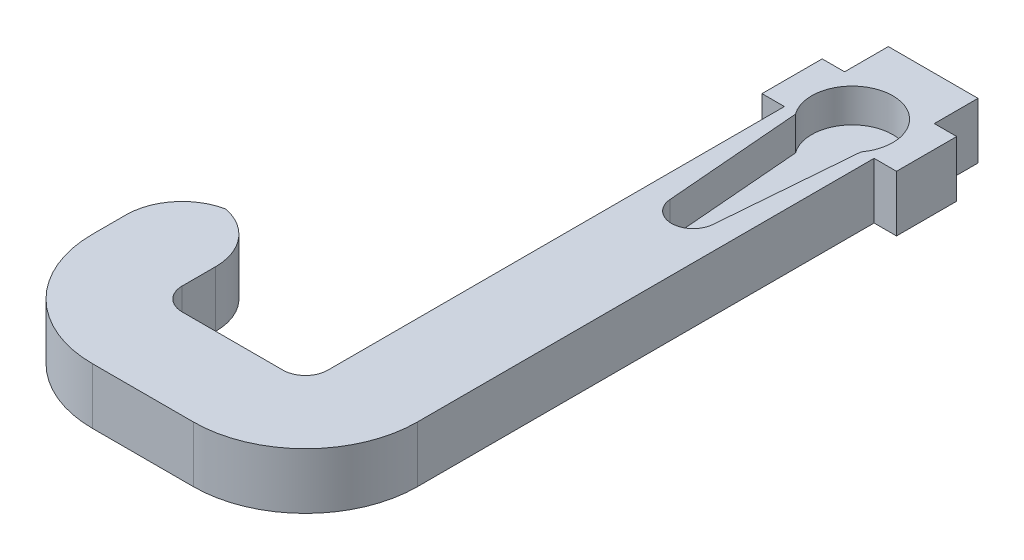
ISO-10303-21;
HEADER;
FILE_DESCRIPTION(('STEP AP214'),'2;1');
FILE_NAME('part.step','',(''),(''),'','','');
FILE_SCHEMA(('AUTOMOTIVE_DESIGN { 1 0 10303 214 1 1 1 1 }'));
ENDSEC;
DATA;
#1=APPLICATION_CONTEXT('core data for automotive mechanical design processes');
#2=APPLICATION_PROTOCOL_DEFINITION('international standard','automotive_design',2000,#1);
#3=PRODUCT_CONTEXT('',#1,'mechanical');
#4=PRODUCT('Part','Part','',(#3));
#5=PRODUCT_RELATED_PRODUCT_CATEGORY('part','',(#4));
#6=PRODUCT_DEFINITION_FORMATION('','',#4);
#7=PRODUCT_DEFINITION_CONTEXT('part definition',#1,'design');
#8=PRODUCT_DEFINITION('design','',#6,#7);
#9=PRODUCT_DEFINITION_SHAPE('','',#8);
#10=(LENGTH_UNIT() NAMED_UNIT(*) SI_UNIT(.MILLI.,.METRE.));
#11=(NAMED_UNIT(*) PLANE_ANGLE_UNIT() SI_UNIT($,.RADIAN.));
#12=(NAMED_UNIT(*) SI_UNIT($,.STERADIAN.) SOLID_ANGLE_UNIT());
#13=UNCERTAINTY_MEASURE_WITH_UNIT(LENGTH_MEASURE(1.E-05),#10,'distance_accuracy_value','');
#14=(GEOMETRIC_REPRESENTATION_CONTEXT(3) GLOBAL_UNCERTAINTY_ASSIGNED_CONTEXT((#13)) GLOBAL_UNIT_ASSIGNED_CONTEXT((#10,
#11,#12)) REPRESENTATION_CONTEXT('',''));
#15=CARTESIAN_POINT('',(0.,0.,0.));
#16=DIRECTION('',(0.,0.,1.));
#17=DIRECTION('',(1.,0.,0.));
#18=AXIS2_PLACEMENT_3D('',#15,#16,#17);
#19=CARTESIAN_POINT('',(21.,5.,-52.1));
#20=DIRECTION('',(-1.,0.,0.));
#21=DIRECTION('',(0.,0.,1.));
#22=AXIS2_PLACEMENT_3D('',#19,#20,#21);
#23=PLANE('',#22);
#24=DIRECTION('',(0.,0.,-1.));
#25=VECTOR('',#24,1.);
#26=CARTESIAN_POINT('',(21.,0.,-52.1));
#27=LINE('',#26,#25);
#28=CARTESIAN_POINT('',(21.,0.,-52.1));
#29=VERTEX_POINT('',#28);
#30=CARTESIAN_POINT('',(21.,0.,-56.));
#31=VERTEX_POINT('',#30);
#32=EDGE_CURVE('E261',#29,#31,#27,.T.);
#33=ORIENTED_EDGE('',*,*,#32,.T.);
#34=DIRECTION('',(0.,-1.,0.));
#35=VECTOR('',#34,1.);
#36=CARTESIAN_POINT('',(21.,5.,-56.));
#37=LINE('',#36,#35);
#38=CARTESIAN_POINT('',(21.,5.,-56.));
#39=VERTEX_POINT('',#38);
#40=EDGE_CURVE('E398',#39,#31,#37,.T.);
#41=ORIENTED_EDGE('',*,*,#40,.F.);
#42=DIRECTION('',(0.,0.,-1.));
#43=VECTOR('',#42,1.);
#44=CARTESIAN_POINT('',(21.,5.,-52.1));
#45=LINE('',#44,#43);
#46=CARTESIAN_POINT('',(21.,5.,-52.1));
#47=VERTEX_POINT('',#46);
#48=EDGE_CURVE('E267',#47,#39,#45,.T.);
#49=ORIENTED_EDGE('',*,*,#48,.F.);
#50=DIRECTION('',(0.,-1.,0.));
#51=VECTOR('',#50,1.);
#52=CARTESIAN_POINT('',(21.,5.,-52.1));
#53=LINE('',#52,#51);
#54=EDGE_CURVE('E316',#47,#29,#53,.T.);
#55=ORIENTED_EDGE('',*,*,#54,.T.);
#56=EDGE_LOOP('',(#33,#41,#49,#55));
#57=FACE_BOUND('',#56,.T.);
#58=ADVANCED_FACE('F43',(#57),#23,.F.);
#59=CARTESIAN_POINT('',(13.,5.,-56.));
#60=DIRECTION('',(0.,0.,1.));
#61=DIRECTION('',(1.,0.,0.));
#62=AXIS2_PLACEMENT_3D('',#59,#60,#61);
#63=PLANE('',#62);
#64=DIRECTION('',(-1.,0.,0.));
#65=VECTOR('',#64,1.);
#66=CARTESIAN_POINT('',(13.,0.,-56.));
#67=LINE('',#66,#65);
#68=CARTESIAN_POINT('',(13.,0.,-56.));
#69=VERTEX_POINT('',#68);
#70=EDGE_CURVE('E320',#31,#69,#67,.T.);
#71=ORIENTED_EDGE('',*,*,#70,.T.);
#72=DIRECTION('',(0.,-1.,0.));
#73=VECTOR('',#72,1.);
#74=CARTESIAN_POINT('',(13.,5.,-56.));
#75=LINE('',#74,#73);
#76=CARTESIAN_POINT('',(13.,5.,-56.));
#77=VERTEX_POINT('',#76);
#78=EDGE_CURVE('E394',#77,#69,#75,.T.);
#79=ORIENTED_EDGE('',*,*,#78,.F.);
#80=DIRECTION('',(-1.,0.,0.));
#81=VECTOR('',#80,1.);
#82=CARTESIAN_POINT('',(13.,5.,-56.));
#83=LINE('',#82,#81);
#84=EDGE_CURVE('E271',#39,#77,#83,.T.);
#85=ORIENTED_EDGE('',*,*,#84,.F.);
#86=ORIENTED_EDGE('',*,*,#40,.T.);
#87=EDGE_LOOP('',(#71,#79,#85,#86));
#88=FACE_BOUND('',#87,.T.);
#89=ADVANCED_FACE('F516',(#88),#63,.F.);
#90=CARTESIAN_POINT('',(13.,5.,-52.1));
#91=DIRECTION('',(1.,0.,0.));
#92=DIRECTION('',(0.,0.,-1.));
#93=AXIS2_PLACEMENT_3D('',#90,#91,#92);
#94=PLANE('',#93);
#95=DIRECTION('',(0.,0.,1.));
#96=VECTOR('',#95,1.);
#97=CARTESIAN_POINT('',(13.,0.,-52.1));
#98=LINE('',#97,#96);
#99=CARTESIAN_POINT('',(13.,0.,-52.1));
#100=VERTEX_POINT('',#99);
#101=EDGE_CURVE('E323',#69,#100,#98,.T.);
#102=ORIENTED_EDGE('',*,*,#101,.T.);
#103=DIRECTION('',(0.,-1.,0.));
#104=VECTOR('',#103,1.);
#105=CARTESIAN_POINT('',(13.,5.,-52.1));
#106=LINE('',#105,#104);
#107=CARTESIAN_POINT('',(13.,5.,-52.1));
#108=VERTEX_POINT('',#107);
#109=EDGE_CURVE('E390',#108,#100,#106,.T.);
#110=ORIENTED_EDGE('',*,*,#109,.F.);
#111=DIRECTION('',(0.,0.,1.));
#112=VECTOR('',#111,1.);
#113=CARTESIAN_POINT('',(13.,5.,-52.1));
#114=LINE('',#113,#112);
#115=EDGE_CURVE('E275',#77,#108,#114,.T.);
#116=ORIENTED_EDGE('',*,*,#115,.F.);
#117=ORIENTED_EDGE('',*,*,#78,.T.);
#118=EDGE_LOOP('',(#102,#110,#116,#117));
#119=FACE_BOUND('',#118,.T.);
#120=ADVANCED_FACE('F512',(#119),#94,.F.);
#121=CARTESIAN_POINT('',(11.,5.,-52.1));
#122=DIRECTION('',(0.,0.,1.));
#123=DIRECTION('',(1.,0.,0.));
#124=AXIS2_PLACEMENT_3D('',#121,#122,#123);
#125=PLANE('',#124);
#126=DIRECTION('',(-1.,0.,0.));
#127=VECTOR('',#126,1.);
#128=CARTESIAN_POINT('',(11.,0.,-52.1));
#129=LINE('',#128,#127);
#130=CARTESIAN_POINT('',(11.,0.,-52.1));
#131=VERTEX_POINT('',#130);
#132=EDGE_CURVE('E326',#100,#131,#129,.T.);
#133=ORIENTED_EDGE('',*,*,#132,.T.);
#134=DIRECTION('',(0.,-1.,0.));
#135=VECTOR('',#134,1.);
#136=CARTESIAN_POINT('',(11.,5.,-52.1));
#137=LINE('',#136,#135);
#138=CARTESIAN_POINT('',(11.,5.,-52.1));
#139=VERTEX_POINT('',#138);
#140=EDGE_CURVE('E386',#139,#131,#137,.T.);
#141=ORIENTED_EDGE('',*,*,#140,.F.);
#142=DIRECTION('',(-1.,0.,0.));
#143=VECTOR('',#142,1.);
#144=CARTESIAN_POINT('',(11.,5.,-52.1));
#145=LINE('',#144,#143);
#146=EDGE_CURVE('E278',#108,#139,#145,.T.);
#147=ORIENTED_EDGE('',*,*,#146,.F.);
#148=ORIENTED_EDGE('',*,*,#109,.T.);
#149=EDGE_LOOP('',(#133,#141,#147,#148));
#150=FACE_BOUND('',#149,.T.);
#151=ADVANCED_FACE('F507',(#150),#125,.F.);
#152=CARTESIAN_POINT('',(11.,5.,-52.1));
#153=DIRECTION('',(1.,0.,0.));
#154=DIRECTION('',(0.,0.,-1.));
#155=AXIS2_PLACEMENT_3D('',#152,#153,#154);
#156=PLANE('',#155);
#157=DIRECTION('',(0.,0.,1.));
#158=VECTOR('',#157,1.);
#159=CARTESIAN_POINT('',(11.,0.,-52.1));
#160=LINE('',#159,#158);
#161=CARTESIAN_POINT('',(11.,0.,-46.73));
#162=VERTEX_POINT('',#161);
#163=EDGE_CURVE('E329',#131,#162,#160,.T.);
#164=ORIENTED_EDGE('',*,*,#163,.T.);
#165=DIRECTION('',(0.,-1.,0.));
#166=VECTOR('',#165,1.);
#167=CARTESIAN_POINT('',(11.,5.,-46.73));
#168=LINE('',#167,#166);
#169=CARTESIAN_POINT('',(11.,5.,-46.73));
#170=VERTEX_POINT('',#169);
#171=EDGE_CURVE('E382',#170,#162,#168,.T.);
#172=ORIENTED_EDGE('',*,*,#171,.F.);
#173=DIRECTION('',(0.,0.,1.));
#174=VECTOR('',#173,1.);
#175=CARTESIAN_POINT('',(11.,5.,-52.1));
#176=LINE('',#175,#174);
#177=EDGE_CURVE('E281',#139,#170,#176,.T.);
#178=ORIENTED_EDGE('',*,*,#177,.F.);
#179=ORIENTED_EDGE('',*,*,#140,.T.);
#180=EDGE_LOOP('',(#164,#172,#178,#179));
#181=FACE_BOUND('',#180,.T.);
#182=ADVANCED_FACE('F503',(#181),#156,.F.);
#183=CARTESIAN_POINT('',(11.,5.,-46.73));
#184=DIRECTION('',(0.,0.,-1.));
#185=DIRECTION('',(-1.,0.,0.));
#186=AXIS2_PLACEMENT_3D('',#183,#184,#185);
#187=PLANE('',#186);
#188=DIRECTION('',(1.,0.,0.));
#189=VECTOR('',#188,1.);
#190=CARTESIAN_POINT('',(11.,0.,-46.73));
#191=LINE('',#190,#189);
#192=CARTESIAN_POINT('',(13.,0.,-46.73));
#193=VERTEX_POINT('',#192);
#194=EDGE_CURVE('E332',#162,#193,#191,.T.);
#195=ORIENTED_EDGE('',*,*,#194,.T.);
#196=DIRECTION('',(0.,-1.,0.));
#197=VECTOR('',#196,1.);
#198=CARTESIAN_POINT('',(13.,5.,-46.73));
#199=LINE('',#198,#197);
#200=CARTESIAN_POINT('',(13.,5.,-46.73));
#201=VERTEX_POINT('',#200);
#202=EDGE_CURVE('E378',#201,#193,#199,.T.);
#203=ORIENTED_EDGE('',*,*,#202,.F.);
#204=DIRECTION('',(1.,0.,0.));
#205=VECTOR('',#204,1.);
#206=CARTESIAN_POINT('',(11.,5.,-46.73));
#207=LINE('',#206,#205);
#208=EDGE_CURVE('E284',#170,#201,#207,.T.);
#209=ORIENTED_EDGE('',*,*,#208,.F.);
#210=ORIENTED_EDGE('',*,*,#171,.T.);
#211=EDGE_LOOP('',(#195,#203,#209,#210));
#212=FACE_BOUND('',#211,.T.);
#213=ADVANCED_FACE('F499',(#212),#187,.F.);
#214=CARTESIAN_POINT('',(13.,5.,-4.));
#215=DIRECTION('',(1.,0.,0.));
#216=DIRECTION('',(0.,0.,-1.));
#217=AXIS2_PLACEMENT_3D('',#214,#215,#216);
#218=PLANE('',#217);
#219=DIRECTION('',(0.,0.,1.));
#220=VECTOR('',#219,1.);
#221=CARTESIAN_POINT('',(13.,0.,-4.));
#222=LINE('',#221,#220);
#223=CARTESIAN_POINT('',(13.,0.,-6.00000000000001));
#224=VERTEX_POINT('',#223);
#225=EDGE_CURVE('E335',#193,#224,#222,.T.);
#226=ORIENTED_EDGE('',*,*,#225,.T.);
#227=DIRECTION('',(0.,-1.,0.));
#228=VECTOR('',#227,1.);
#229=CARTESIAN_POINT('',(13.,5.,-6.00000000000001));
#230=LINE('',#229,#228);
#231=CARTESIAN_POINT('',(13.,5.,-6.00000000000001));
#232=VERTEX_POINT('',#231);
#233=EDGE_CURVE('E59',#224,#232,#230,.F.);
#234=ORIENTED_EDGE('',*,*,#233,.T.);
#235=DIRECTION('',(0.,0.,1.));
#236=VECTOR('',#235,1.);
#237=CARTESIAN_POINT('',(13.,5.,-4.));
#238=LINE('',#237,#236);
#239=EDGE_CURVE('E287',#201,#232,#238,.T.);
#240=ORIENTED_EDGE('',*,*,#239,.F.);
#241=ORIENTED_EDGE('',*,*,#202,.T.);
#242=EDGE_LOOP('',(#226,#234,#240,#241));
#243=FACE_BOUND('',#242,.T.);
#244=ADVANCED_FACE('F494',(#243),#218,.F.);
#245=CARTESIAN_POINT('',(0.,5.,-4.));
#246=DIRECTION('',(0.,0.,1.));
#247=DIRECTION('',(1.,0.,0.));
#248=AXIS2_PLACEMENT_3D('',#245,#246,#247);
#249=PLANE('',#248);
#250=DIRECTION('',(-1.,0.,0.));
#251=VECTOR('',#250,1.);
#252=CARTESIAN_POINT('',(0.,0.,-4.));
#253=LINE('',#252,#251);
#254=CARTESIAN_POINT('',(11.,0.,-4.));
#255=VERTEX_POINT('',#254);
#256=CARTESIAN_POINT('',(2.,0.,-4.));
#257=VERTEX_POINT('',#256);
#258=EDGE_CURVE('E338',#255,#257,#253,.T.);
#259=ORIENTED_EDGE('',*,*,#258,.T.);
#260=DIRECTION('',(0.,-1.,0.));
#261=VECTOR('',#260,1.);
#262=CARTESIAN_POINT('',(2.,5.,-4.));
#263=LINE('',#262,#261);
#264=CARTESIAN_POINT('',(2.,5.,-4.));
#265=VERTEX_POINT('',#264);
#266=EDGE_CURVE('E461',#257,#265,#263,.F.);
#267=ORIENTED_EDGE('',*,*,#266,.T.);
#268=DIRECTION('',(-1.,0.,0.));
#269=VECTOR('',#268,1.);
#270=CARTESIAN_POINT('',(0.,5.,-4.));
#271=LINE('',#270,#269);
#272=CARTESIAN_POINT('',(11.,5.,-4.));
#273=VERTEX_POINT('',#272);
#274=EDGE_CURVE('E290',#273,#265,#271,.T.);
#275=ORIENTED_EDGE('',*,*,#274,.F.);
#276=DIRECTION('',(0.,-1.,0.));
#277=VECTOR('',#276,1.);
#278=CARTESIAN_POINT('',(11.,0.,-4.));
#279=LINE('',#278,#277);
#280=EDGE_CURVE('E457',#273,#255,#279,.T.);
#281=ORIENTED_EDGE('',*,*,#280,.T.);
#282=EDGE_LOOP('',(#259,#267,#275,#281));
#283=FACE_BOUND('',#282,.T.);
#284=ADVANCED_FACE('F488',(#283),#249,.F.);
#285=CARTESIAN_POINT('',(0.,5.,-4.));
#286=DIRECTION('',(-1.,0.,0.));
#287=DIRECTION('',(0.,0.,1.));
#288=AXIS2_PLACEMENT_3D('',#285,#286,#287);
#289=PLANE('',#288);
#290=DIRECTION('',(0.,0.,-1.));
#291=VECTOR('',#290,1.);
#292=CARTESIAN_POINT('',(0.,5.,-4.));
#293=LINE('',#292,#291);
#294=CARTESIAN_POINT('',(0.,5.,-6.));
#295=VERTEX_POINT('',#294);
#296=CARTESIAN_POINT('',(0.,5.,-9.));
#297=VERTEX_POINT('',#296);
#298=EDGE_CURVE('E294',#295,#297,#293,.T.);
#299=ORIENTED_EDGE('',*,*,#298,.F.);
#300=DIRECTION('',(0.,-1.,0.));
#301=VECTOR('',#300,1.);
#302=CARTESIAN_POINT('',(0.,0.,-6.));
#303=LINE('',#302,#301);
#304=CARTESIAN_POINT('',(0.,0.,-6.));
#305=VERTEX_POINT('',#304);
#306=EDGE_CURVE('E450',#295,#305,#303,.T.);
#307=ORIENTED_EDGE('',*,*,#306,.T.);
#308=DIRECTION('',(0.,0.,-1.));
#309=VECTOR('',#308,1.);
#310=CARTESIAN_POINT('',(0.,0.,-4.));
#311=LINE('',#310,#309);
#312=CARTESIAN_POINT('',(0.,0.,-9.));
#313=VERTEX_POINT('',#312);
#314=EDGE_CURVE('E342',#305,#313,#311,.T.);
#315=ORIENTED_EDGE('',*,*,#314,.T.);
#316=DIRECTION('',(0.,-1.,0.));
#317=VECTOR('',#316,1.);
#318=CARTESIAN_POINT('',(0.,5.,-9.));
#319=LINE('',#318,#317);
#320=EDGE_CURVE('E437',#313,#297,#319,.F.);
#321=ORIENTED_EDGE('',*,*,#320,.T.);
#322=EDGE_LOOP('',(#299,#307,#315,#321));
#323=FACE_BOUND('',#322,.T.);
#324=ADVANCED_FACE('F482',(#323),#289,.F.);
#325=CARTESIAN_POINT('',(-8.,5.,3.99999999999999));
#326=DIRECTION('',(1.,0.,0.));
#327=DIRECTION('',(0.,0.,-1.));
#328=AXIS2_PLACEMENT_3D('',#325,#326,#327);
#329=PLANE('',#328);
#330=DIRECTION('',(0.,0.,1.));
#331=VECTOR('',#330,1.);
#332=CARTESIAN_POINT('',(-8.,5.,3.99999999999999));
#333=LINE('',#332,#331);
#334=CARTESIAN_POINT('',(-8.,5.,-9.));
#335=VERTEX_POINT('',#334);
#336=CARTESIAN_POINT('',(-8.,5.,-6.));
#337=VERTEX_POINT('',#336);
#338=EDGE_CURVE('E297',#335,#337,#333,.T.);
#339=ORIENTED_EDGE('',*,*,#338,.F.);
#340=DIRECTION('',(0.,-1.,0.));
#341=VECTOR('',#340,1.);
#342=CARTESIAN_POINT('',(-8.,5.,-9.));
#343=LINE('',#342,#341);
#344=CARTESIAN_POINT('',(-8.,0.,-9.));
#345=VERTEX_POINT('',#344);
#346=EDGE_CURVE('E447',#335,#345,#343,.T.);
#347=ORIENTED_EDGE('',*,*,#346,.T.);
#348=DIRECTION('',(0.,0.,1.));
#349=VECTOR('',#348,1.);
#350=CARTESIAN_POINT('',(-8.,0.,3.99999999999999));
#351=LINE('',#350,#349);
#352=CARTESIAN_POINT('',(-8.,0.,-6.));
#353=VERTEX_POINT('',#352);
#354=EDGE_CURVE('E345',#345,#353,#351,.T.);
#355=ORIENTED_EDGE('',*,*,#354,.T.);
#356=DIRECTION('',(0.,-1.,0.));
#357=VECTOR('',#356,1.);
#358=CARTESIAN_POINT('',(-8.,5.,-6.));
#359=LINE('',#358,#357);
#360=EDGE_CURVE('E416',#353,#337,#359,.F.);
#361=ORIENTED_EDGE('',*,*,#360,.T.);
#362=EDGE_LOOP('',(#339,#347,#355,#361));
#363=FACE_BOUND('',#362,.T.);
#364=ADVANCED_FACE('F566',(#363),#329,.F.);
#365=CARTESIAN_POINT('',(21.,5.,4.));
#366=DIRECTION('',(0.,0.,-1.));
#367=DIRECTION('',(-1.,0.,0.));
#368=AXIS2_PLACEMENT_3D('',#365,#366,#367);
#369=PLANE('',#368);
#370=DIRECTION('',(1.,0.,0.));
#371=VECTOR('',#370,1.);
#372=CARTESIAN_POINT('',(0.,5.,4.));
#373=LINE('',#372,#371);
#374=CARTESIAN_POINT('',(2.00000000000001,5.,4.));
#375=VERTEX_POINT('',#374);
#376=CARTESIAN_POINT('',(11.,5.,4.));
#377=VERTEX_POINT('',#376);
#378=EDGE_CURVE('E300',#375,#377,#373,.T.);
#379=ORIENTED_EDGE('',*,*,#378,.F.);
#380=DIRECTION('',(0.,-1.,0.));
#381=VECTOR('',#380,1.);
#382=CARTESIAN_POINT('',(2.00000000000001,5.,4.));
#383=LINE('',#382,#381);
#384=CARTESIAN_POINT('',(2.00000000000001,0.,4.));
#385=VERTEX_POINT('',#384);
#386=EDGE_CURVE('E405',#375,#385,#383,.T.);
#387=ORIENTED_EDGE('',*,*,#386,.T.);
#388=DIRECTION('',(1.,0.,0.));
#389=VECTOR('',#388,1.);
#390=CARTESIAN_POINT('',(21.,0.,4.));
#391=LINE('',#390,#389);
#392=CARTESIAN_POINT('',(11.,0.,4.));
#393=VERTEX_POINT('',#392);
#394=EDGE_CURVE('E348',#385,#393,#391,.T.);
#395=ORIENTED_EDGE('',*,*,#394,.T.);
#396=DIRECTION('',(0.,-1.,0.));
#397=VECTOR('',#396,1.);
#398=CARTESIAN_POINT('',(11.,5.,4.));
#399=LINE('',#398,#397);
#400=EDGE_CURVE('E402',#393,#377,#399,.F.);
#401=ORIENTED_EDGE('',*,*,#400,.T.);
#402=EDGE_LOOP('',(#379,#387,#395,#401));
#403=FACE_BOUND('',#402,.T.);
#404=ADVANCED_FACE('F548',(#403),#369,.F.);
#405=CARTESIAN_POINT('',(21.,5.,-4.));
#406=DIRECTION('',(-1.,0.,0.));
#407=DIRECTION('',(0.,0.,1.));
#408=AXIS2_PLACEMENT_3D('',#405,#406,#407);
#409=PLANE('',#408);
#410=DIRECTION('',(0.,0.,-1.));
#411=VECTOR('',#410,1.);
#412=CARTESIAN_POINT('',(21.,5.,4.));
#413=LINE('',#412,#411);
#414=CARTESIAN_POINT('',(21.,5.,-6.));
#415=VERTEX_POINT('',#414);
#416=CARTESIAN_POINT('',(21.,5.,-46.73));
#417=VERTEX_POINT('',#416);
#418=EDGE_CURVE('E304',#415,#417,#413,.T.);
#419=ORIENTED_EDGE('',*,*,#418,.F.);
#420=DIRECTION('',(0.,-1.,0.));
#421=VECTOR('',#420,1.);
#422=CARTESIAN_POINT('',(21.,5.,-6.));
#423=LINE('',#422,#421);
#424=CARTESIAN_POINT('',(21.,0.,-6.));
#425=VERTEX_POINT('',#424);
#426=EDGE_CURVE('E426',#415,#425,#423,.T.);
#427=ORIENTED_EDGE('',*,*,#426,.T.);
#428=DIRECTION('',(0.,0.,-1.));
#429=VECTOR('',#428,1.);
#430=CARTESIAN_POINT('',(21.,0.,-4.));
#431=LINE('',#430,#429);
#432=CARTESIAN_POINT('',(21.,0.,-46.73));
#433=VERTEX_POINT('',#432);
#434=EDGE_CURVE('E352',#425,#433,#431,.T.);
#435=ORIENTED_EDGE('',*,*,#434,.T.);
#436=DIRECTION('',(0.,-1.,0.));
#437=VECTOR('',#436,1.);
#438=CARTESIAN_POINT('',(21.,5.,-46.73));
#439=LINE('',#438,#437);
#440=EDGE_CURVE('E374',#417,#433,#439,.T.);
#441=ORIENTED_EDGE('',*,*,#440,.F.);
#442=EDGE_LOOP('',(#419,#427,#435,#441));
#443=FACE_BOUND('',#442,.T.);
#444=ADVANCED_FACE('F540',(#443),#409,.F.);
#445=CARTESIAN_POINT('',(21.,5.,-46.73));
#446=DIRECTION('',(0.,0.,-1.));
#447=DIRECTION('',(-1.,0.,0.));
#448=AXIS2_PLACEMENT_3D('',#445,#446,#447);
#449=PLANE('',#448);
#450=DIRECTION('',(1.,0.,0.));
#451=VECTOR('',#450,1.);
#452=CARTESIAN_POINT('',(21.,0.,-46.73));
#453=LINE('',#452,#451);
#454=CARTESIAN_POINT('',(23.,0.,-46.73));
#455=VERTEX_POINT('',#454);
#456=EDGE_CURVE('E355',#433,#455,#453,.T.);
#457=ORIENTED_EDGE('',*,*,#456,.T.);
#458=DIRECTION('',(0.,-1.,0.));
#459=VECTOR('',#458,1.);
#460=CARTESIAN_POINT('',(23.,5.,-46.73));
#461=LINE('',#460,#459);
#462=CARTESIAN_POINT('',(23.,5.,-46.73));
#463=VERTEX_POINT('',#462);
#464=EDGE_CURVE('E370',#463,#455,#461,.T.);
#465=ORIENTED_EDGE('',*,*,#464,.F.);
#466=DIRECTION('',(1.,0.,0.));
#467=VECTOR('',#466,1.);
#468=CARTESIAN_POINT('',(21.,5.,-46.73));
#469=LINE('',#468,#467);
#470=EDGE_CURVE('E307',#417,#463,#469,.T.);
#471=ORIENTED_EDGE('',*,*,#470,.F.);
#472=ORIENTED_EDGE('',*,*,#440,.T.);
#473=EDGE_LOOP('',(#457,#465,#471,#472));
#474=FACE_BOUND('',#473,.T.);
#475=ADVANCED_FACE('F534',(#474),#449,.F.);
#476=CARTESIAN_POINT('',(23.,5.,-52.1));
#477=DIRECTION('',(-1.,0.,0.));
#478=DIRECTION('',(0.,0.,1.));
#479=AXIS2_PLACEMENT_3D('',#476,#477,#478);
#480=PLANE('',#479);
#481=DIRECTION('',(0.,0.,-1.));
#482=VECTOR('',#481,1.);
#483=CARTESIAN_POINT('',(23.,0.,-52.1));
#484=LINE('',#483,#482);
#485=CARTESIAN_POINT('',(23.,0.,-52.1));
#486=VERTEX_POINT('',#485);
#487=EDGE_CURVE('E358',#455,#486,#484,.T.);
#488=ORIENTED_EDGE('',*,*,#487,.T.);
#489=DIRECTION('',(0.,-1.,0.));
#490=VECTOR('',#489,1.);
#491=CARTESIAN_POINT('',(23.,5.,-52.1));
#492=LINE('',#491,#490);
#493=CARTESIAN_POINT('',(23.,5.,-52.1));
#494=VERTEX_POINT('',#493);
#495=EDGE_CURVE('E366',#494,#486,#492,.T.);
#496=ORIENTED_EDGE('',*,*,#495,.F.);
#497=DIRECTION('',(0.,0.,-1.));
#498=VECTOR('',#497,1.);
#499=CARTESIAN_POINT('',(23.,5.,-52.1));
#500=LINE('',#499,#498);
#501=EDGE_CURVE('E310',#463,#494,#500,.T.);
#502=ORIENTED_EDGE('',*,*,#501,.F.);
#503=ORIENTED_EDGE('',*,*,#464,.T.);
#504=EDGE_LOOP('',(#488,#496,#502,#503));
#505=FACE_BOUND('',#504,.T.);
#506=ADVANCED_FACE('F530',(#505),#480,.F.);
#507=CARTESIAN_POINT('',(21.,5.,-52.1));
#508=DIRECTION('',(0.,0.,1.));
#509=DIRECTION('',(1.,0.,0.));
#510=AXIS2_PLACEMENT_3D('',#507,#508,#509);
#511=PLANE('',#510);
#512=DIRECTION('',(-1.,0.,0.));
#513=VECTOR('',#512,1.);
#514=CARTESIAN_POINT('',(21.,0.,-52.1));
#515=LINE('',#514,#513);
#516=EDGE_CURVE('E272',#486,#29,#515,.T.);
#517=ORIENTED_EDGE('',*,*,#516,.T.);
#518=ORIENTED_EDGE('',*,*,#54,.F.);
#519=DIRECTION('',(-1.,0.,0.));
#520=VECTOR('',#519,1.);
#521=CARTESIAN_POINT('',(21.,5.,-52.1));
#522=LINE('',#521,#520);
#523=EDGE_CURVE('E313',#494,#47,#522,.T.);
#524=ORIENTED_EDGE('',*,*,#523,.F.);
#525=ORIENTED_EDGE('',*,*,#495,.T.);
#526=EDGE_LOOP('',(#517,#518,#524,#525));
#527=FACE_BOUND('',#526,.T.);
#528=ADVANCED_FACE('F525',(#527),#511,.F.);
#529=CARTESIAN_POINT('',(0.,5.,0.));
#530=DIRECTION('',(0.,-1.,0.));
#531=DIRECTION('',(0.,0.,-1.));
#532=AXIS2_PLACEMENT_3D('',#529,#530,#531);
#533=PLANE('',#532);
#534=DIRECTION('',(0.0814505215145928,0.,0.996677386391906));
#535=VECTOR('',#534,1.);
#536=CARTESIAN_POINT('',(14.079,5.,-46.641739258182));
#537=LINE('',#536,#535);
#538=CARTESIAN_POINT('',(14.079,5.,-46.641739258182));
#539=VERTEX_POINT('',#538);
#540=CARTESIAN_POINT('',(15.0764126442636,5.,-34.4368004934768));
#541=VERTEX_POINT('',#540);
#542=EDGE_CURVE('E251',#539,#541,#537,.T.);
#543=ORIENTED_EDGE('',*,*,#542,.F.);
#544=CARTESIAN_POINT('',(17.,5.,-48.78));
#545=DIRECTION('',(0.,1.,0.));
#546=DIRECTION('',(0.,0.,1.));
#547=AXIS2_PLACEMENT_3D('',#544,#545,#546);
#548=CIRCLE('',#547,3.62);
#549=CARTESIAN_POINT('',(19.921,5.,-46.641739258182));
#550=VERTEX_POINT('',#549);
#551=EDGE_CURVE('E218',#550,#539,#548,.T.);
#552=ORIENTED_EDGE('',*,*,#551,.F.);
#553=DIRECTION('',(0.081450521514593,0.,-0.996677386391906));
#554=VECTOR('',#553,1.);
#555=CARTESIAN_POINT('',(19.921,5.,-46.641739258182));
#556=LINE('',#555,#554);
#557=CARTESIAN_POINT('',(18.9235873557364,5.,-34.4368004934768));
#558=VERTEX_POINT('',#557);
#559=EDGE_CURVE('E238',#558,#550,#556,.T.);
#560=ORIENTED_EDGE('',*,*,#559,.F.);
#561=CARTESIAN_POINT('',(17.,5.,-34.594));
#562=DIRECTION('',(0.,1.,0.));
#563=DIRECTION('',(0.,0.,-1.));
#564=AXIS2_PLACEMENT_3D('',#561,#562,#563);
#565=CIRCLE('',#564,1.93);
#566=EDGE_CURVE('E242',#541,#558,#565,.T.);
#567=ORIENTED_EDGE('',*,*,#566,.F.);
#568=EDGE_LOOP('',(#543,#552,#560,#567));
#569=FACE_BOUND('',#568,.T.);
#570=ORIENTED_EDGE('',*,*,#274,.T.);
#571=CARTESIAN_POINT('',(2.,5.,-6.));
#572=DIRECTION('',(0.,-1.,0.));
#573=DIRECTION('',(0.,0.,-1.));
#574=AXIS2_PLACEMENT_3D('',#571,#572,#573);
#575=CIRCLE('',#574,2.);
#576=EDGE_CURVE('E469',#265,#295,#575,.T.);
#577=ORIENTED_EDGE('',*,*,#576,.T.);
#578=ORIENTED_EDGE('',*,*,#298,.T.);
#579=CARTESIAN_POINT('',(-5.,5.,-9.));
#580=DIRECTION('',(0.,-1.,0.));
#581=DIRECTION('',(0.,0.,-1.));
#582=AXIS2_PLACEMENT_3D('',#579,#580,#581);
#583=CIRCLE('',#582,5.);
#584=CARTESIAN_POINT('',(-4.,5.,-13.8989794855664));
#585=VERTEX_POINT('',#584);
#586=EDGE_CURVE('E444',#297,#585,#583,.F.);
#587=ORIENTED_EDGE('',*,*,#586,.T.);
#588=CARTESIAN_POINT('',(-3.,5.,-9.));
#589=DIRECTION('',(0.,-1.,0.));
#590=DIRECTION('',(0.,0.,-1.));
#591=AXIS2_PLACEMENT_3D('',#588,#589,#590);
#592=CIRCLE('',#591,5.);
#593=EDGE_CURVE('E441',#585,#335,#592,.F.);
#594=ORIENTED_EDGE('',*,*,#593,.T.);
#595=ORIENTED_EDGE('',*,*,#338,.T.);
#596=CARTESIAN_POINT('',(2.,5.,-6.));
#597=DIRECTION('',(0.,-1.,0.));
#598=DIRECTION('',(0.,0.,-1.));
#599=AXIS2_PLACEMENT_3D('',#596,#597,#598);
#600=CIRCLE('',#599,10.);
#601=EDGE_CURVE('E423',#337,#375,#600,.F.);
#602=ORIENTED_EDGE('',*,*,#601,.T.);
#603=ORIENTED_EDGE('',*,*,#378,.T.);
#604=CARTESIAN_POINT('',(11.,5.,-6.));
#605=DIRECTION('',(0.,-1.,0.));
#606=DIRECTION('',(0.,0.,-1.));
#607=AXIS2_PLACEMENT_3D('',#604,#605,#606);
#608=CIRCLE('',#607,10.);
#609=EDGE_CURVE('E420',#377,#415,#608,.F.);
#610=ORIENTED_EDGE('',*,*,#609,.T.);
#611=ORIENTED_EDGE('',*,*,#418,.T.);
#612=ORIENTED_EDGE('',*,*,#470,.T.);
#613=ORIENTED_EDGE('',*,*,#501,.T.);
#614=ORIENTED_EDGE('',*,*,#523,.T.);
#615=ORIENTED_EDGE('',*,*,#48,.T.);
#616=ORIENTED_EDGE('',*,*,#84,.T.);
#617=ORIENTED_EDGE('',*,*,#115,.T.);
#618=ORIENTED_EDGE('',*,*,#146,.T.);
#619=ORIENTED_EDGE('',*,*,#177,.T.);
#620=ORIENTED_EDGE('',*,*,#208,.T.);
#621=ORIENTED_EDGE('',*,*,#239,.T.);
#622=CARTESIAN_POINT('',(11.,5.,-6.));
#623=DIRECTION('',(0.,-1.,0.));
#624=DIRECTION('',(0.,0.,-1.));
#625=AXIS2_PLACEMENT_3D('',#622,#623,#624);
#626=CIRCLE('',#625,2.);
#627=EDGE_CURVE('E11',#232,#273,#626,.T.);
#628=ORIENTED_EDGE('',*,*,#627,.T.);
#629=EDGE_LOOP('',(#570,#577,#578,#587,#594,#595,#602,#603,#610,#611,#612,#613,#614,#615,#616,
#617,#618,#619,#620,#621,#628));
#630=FACE_BOUND('',#629,.T.);
#631=ADVANCED_FACE('F475',(#569,#630),#533,.F.);
#632=CARTESIAN_POINT('',(0.,0.,0.));
#633=DIRECTION('',(0.,-1.,0.));
#634=DIRECTION('',(0.,0.,-1.));
#635=AXIS2_PLACEMENT_3D('',#632,#633,#634);
#636=PLANE('',#635);
#637=CARTESIAN_POINT('',(-3.,0.,-9.));
#638=DIRECTION('',(0.,-1.,0.));
#639=DIRECTION('',(0.,0.,-1.));
#640=AXIS2_PLACEMENT_3D('',#637,#638,#639);
#641=CIRCLE('',#640,5.);
#642=CARTESIAN_POINT('',(-4.,0.,-13.8989794855664));
#643=VERTEX_POINT('',#642);
#644=EDGE_CURVE('E430',#345,#643,#641,.T.);
#645=ORIENTED_EDGE('',*,*,#644,.T.);
#646=CARTESIAN_POINT('',(-5.,0.,-9.));
#647=DIRECTION('',(0.,-1.,0.));
#648=DIRECTION('',(0.,0.,-1.));
#649=AXIS2_PLACEMENT_3D('',#646,#647,#648);
#650=CIRCLE('',#649,5.);
#651=EDGE_CURVE('E433',#643,#313,#650,.T.);
#652=ORIENTED_EDGE('',*,*,#651,.T.);
#653=ORIENTED_EDGE('',*,*,#314,.F.);
#654=CARTESIAN_POINT('',(2.,0.,-6.));
#655=DIRECTION('',(0.,-1.,0.));
#656=DIRECTION('',(0.,0.,-1.));
#657=AXIS2_PLACEMENT_3D('',#654,#655,#656);
#658=CIRCLE('',#657,2.);
#659=EDGE_CURVE('E466',#305,#257,#658,.F.);
#660=ORIENTED_EDGE('',*,*,#659,.T.);
#661=ORIENTED_EDGE('',*,*,#258,.F.);
#662=CARTESIAN_POINT('',(11.,0.,-6.));
#663=DIRECTION('',(0.,-1.,0.));
#664=DIRECTION('',(0.,0.,-1.));
#665=AXIS2_PLACEMENT_3D('',#662,#663,#664);
#666=CIRCLE('',#665,2.);
#667=EDGE_CURVE('E52',#255,#224,#666,.F.);
#668=ORIENTED_EDGE('',*,*,#667,.T.);
#669=ORIENTED_EDGE('',*,*,#225,.F.);
#670=ORIENTED_EDGE('',*,*,#194,.F.);
#671=ORIENTED_EDGE('',*,*,#163,.F.);
#672=ORIENTED_EDGE('',*,*,#132,.F.);
#673=ORIENTED_EDGE('',*,*,#101,.F.);
#674=ORIENTED_EDGE('',*,*,#70,.F.);
#675=ORIENTED_EDGE('',*,*,#32,.F.);
#676=ORIENTED_EDGE('',*,*,#516,.F.);
#677=ORIENTED_EDGE('',*,*,#487,.F.);
#678=ORIENTED_EDGE('',*,*,#456,.F.);
#679=ORIENTED_EDGE('',*,*,#434,.F.);
#680=CARTESIAN_POINT('',(11.,0.,-6.));
#681=DIRECTION('',(0.,-1.,0.));
#682=DIRECTION('',(0.,0.,-1.));
#683=AXIS2_PLACEMENT_3D('',#680,#681,#682);
#684=CIRCLE('',#683,10.);
#685=EDGE_CURVE('E409',#425,#393,#684,.T.);
#686=ORIENTED_EDGE('',*,*,#685,.T.);
#687=ORIENTED_EDGE('',*,*,#394,.F.);
#688=CARTESIAN_POINT('',(2.,0.,-6.));
#689=DIRECTION('',(0.,-1.,0.));
#690=DIRECTION('',(0.,0.,-1.));
#691=AXIS2_PLACEMENT_3D('',#688,#689,#690);
#692=CIRCLE('',#691,10.);
#693=EDGE_CURVE('E412',#385,#353,#692,.T.);
#694=ORIENTED_EDGE('',*,*,#693,.T.);
#695=ORIENTED_EDGE('',*,*,#354,.F.);
#696=EDGE_LOOP('',(#645,#652,#653,#660,#661,#668,#669,#670,#671,#672,#673,#674,#675,#676,#677,
#678,#679,#686,#687,#694,#695));
#697=FACE_BOUND('',#696,.T.);
#698=ADVANCED_FACE('F486',(#697),#636,.T.);
#699=CARTESIAN_POINT('',(17.,2.,-48.78));
#700=DIRECTION('',(0.,1.,0.));
#701=DIRECTION('',(0.,0.,1.));
#702=AXIS2_PLACEMENT_3D('',#699,#700,#701);
#703=CYLINDRICAL_SURFACE('',#702,3.62);
#704=ORIENTED_EDGE('',*,*,#551,.T.);
#705=DIRECTION('',(0.,1.,0.));
#706=VECTOR('',#705,1.);
#707=CARTESIAN_POINT('',(14.079,2.,-46.641739258182));
#708=LINE('',#707,#706);
#709=CARTESIAN_POINT('',(14.079,2.,-46.641739258182));
#710=VERTEX_POINT('',#709);
#711=EDGE_CURVE('E211',#710,#539,#708,.T.);
#712=ORIENTED_EDGE('',*,*,#711,.F.);
#713=CARTESIAN_POINT('',(17.,2.,-48.78));
#714=DIRECTION('',(0.,1.,0.));
#715=DIRECTION('',(0.,0.,1.));
#716=AXIS2_PLACEMENT_3D('',#713,#714,#715);
#717=CIRCLE('',#716,3.62);
#718=CARTESIAN_POINT('',(19.921,2.,-46.641739258182));
#719=VERTEX_POINT('',#718);
#720=EDGE_CURVE('E215',#719,#710,#717,.T.);
#721=ORIENTED_EDGE('',*,*,#720,.F.);
#722=DIRECTION('',(0.,1.,0.));
#723=VECTOR('',#722,1.);
#724=CARTESIAN_POINT('',(19.921,2.,-46.641739258182));
#725=LINE('',#724,#723);
#726=EDGE_CURVE('E258',#719,#550,#725,.T.);
#727=ORIENTED_EDGE('',*,*,#726,.T.);
#728=EDGE_LOOP('',(#704,#712,#721,#727));
#729=FACE_BOUND('',#728,.T.);
#730=ADVANCED_FACE('F213',(#729),#703,.F.);
#731=CARTESIAN_POINT('',(19.921,2.,-46.641739258182));
#732=DIRECTION('',(0.996677386391906,0.,0.0814505215145929));
#733=DIRECTION('',(0.0814505215145929,0.,-0.996677386391906));
#734=AXIS2_PLACEMENT_3D('',#731,#732,#733);
#735=PLANE('',#734);
#736=ORIENTED_EDGE('',*,*,#559,.T.);
#737=ORIENTED_EDGE('',*,*,#726,.F.);
#738=DIRECTION('',(0.081450521514593,0.,-0.996677386391906));
#739=VECTOR('',#738,1.);
#740=CARTESIAN_POINT('',(19.921,2.,-46.641739258182));
#741=LINE('',#740,#739);
#742=CARTESIAN_POINT('',(18.9235873557364,2.,-34.4368004934768));
#743=VERTEX_POINT('',#742);
#744=EDGE_CURVE('E224',#743,#719,#741,.T.);
#745=ORIENTED_EDGE('',*,*,#744,.F.);
#746=DIRECTION('',(0.,1.,0.));
#747=VECTOR('',#746,1.);
#748=CARTESIAN_POINT('',(18.9235873557364,2.,-34.4368004934768));
#749=LINE('',#748,#747);
#750=EDGE_CURVE('E262',#743,#558,#749,.T.);
#751=ORIENTED_EDGE('',*,*,#750,.T.);
#752=EDGE_LOOP('',(#736,#737,#745,#751));
#753=FACE_BOUND('',#752,.T.);
#754=ADVANCED_FACE('F717',(#753),#735,.F.);
#755=CARTESIAN_POINT('',(17.,2.,-34.594));
#756=DIRECTION('',(0.,1.,0.));
#757=DIRECTION('',(0.,0.,1.));
#758=AXIS2_PLACEMENT_3D('',#755,#756,#757);
#759=CYLINDRICAL_SURFACE('',#758,1.93);
#760=ORIENTED_EDGE('',*,*,#566,.T.);
#761=ORIENTED_EDGE('',*,*,#750,.F.);
#762=CARTESIAN_POINT('',(17.,2.,-34.594));
#763=DIRECTION('',(0.,1.,0.));
#764=DIRECTION('',(0.,0.,-1.));
#765=AXIS2_PLACEMENT_3D('',#762,#763,#764);
#766=CIRCLE('',#765,1.93);
#767=CARTESIAN_POINT('',(15.0764126442636,2.,-34.4368004934768));
#768=VERTEX_POINT('',#767);
#769=EDGE_CURVE('E233',#768,#743,#766,.T.);
#770=ORIENTED_EDGE('',*,*,#769,.F.);
#771=DIRECTION('',(0.,1.,0.));
#772=VECTOR('',#771,1.);
#773=CARTESIAN_POINT('',(15.0764126442636,2.,-34.4368004934768));
#774=LINE('',#773,#772);
#775=EDGE_CURVE('E223',#768,#541,#774,.T.);
#776=ORIENTED_EDGE('',*,*,#775,.T.);
#777=EDGE_LOOP('',(#760,#761,#770,#776));
#778=FACE_BOUND('',#777,.T.);
#779=ADVANCED_FACE('F708',(#778),#759,.F.);
#780=CARTESIAN_POINT('',(14.079,2.,-46.641739258182));
#781=DIRECTION('',(-0.996677386391906,0.,0.0814505215145928));
#782=DIRECTION('',(0.0814505215145928,0.,0.996677386391906));
#783=AXIS2_PLACEMENT_3D('',#780,#781,#782);
#784=PLANE('',#783);
#785=ORIENTED_EDGE('',*,*,#542,.T.);
#786=ORIENTED_EDGE('',*,*,#775,.F.);
#787=DIRECTION('',(0.0814505215145928,0.,0.996677386391906));
#788=VECTOR('',#787,1.);
#789=CARTESIAN_POINT('',(14.079,2.,-46.641739258182));
#790=LINE('',#789,#788);
#791=EDGE_CURVE('E227',#710,#768,#790,.T.);
#792=ORIENTED_EDGE('',*,*,#791,.F.);
#793=ORIENTED_EDGE('',*,*,#711,.T.);
#794=EDGE_LOOP('',(#785,#786,#792,#793));
#795=FACE_BOUND('',#794,.T.);
#796=ADVANCED_FACE('F228',(#795),#784,.F.);
#797=CARTESIAN_POINT('',(17.,2.,-48.78));
#798=DIRECTION('',(0.,1.,0.));
#799=DIRECTION('',(0.,0.,1.));
#800=AXIS2_PLACEMENT_3D('',#797,#798,#799);
#801=PLANE('',#800);
#802=ORIENTED_EDGE('',*,*,#720,.T.);
#803=ORIENTED_EDGE('',*,*,#791,.T.);
#804=ORIENTED_EDGE('',*,*,#769,.T.);
#805=ORIENTED_EDGE('',*,*,#744,.T.);
#806=EDGE_LOOP('',(#802,#803,#804,#805));
#807=FACE_BOUND('',#806,.T.);
#808=ADVANCED_FACE('F235',(#807),#801,.T.);
#809=CARTESIAN_POINT('',(2.,5.,-6.));
#810=DIRECTION('',(0.,-1.,0.));
#811=DIRECTION('',(0.,0.,-1.));
#812=AXIS2_PLACEMENT_3D('',#809,#810,#811);
#813=CYLINDRICAL_SURFACE('',#812,10.);
#814=ORIENTED_EDGE('',*,*,#601,.F.);
#815=ORIENTED_EDGE('',*,*,#360,.F.);
#816=ORIENTED_EDGE('',*,*,#693,.F.);
#817=ORIENTED_EDGE('',*,*,#386,.F.);
#818=EDGE_LOOP('',(#814,#815,#816,#817));
#819=FACE_BOUND('',#818,.T.);
#820=ADVANCED_FACE('F554',(#819),#813,.T.);
#821=CARTESIAN_POINT('',(11.,5.,-6.));
#822=DIRECTION('',(0.,-1.,0.));
#823=DIRECTION('',(0.,0.,-1.));
#824=AXIS2_PLACEMENT_3D('',#821,#822,#823);
#825=CYLINDRICAL_SURFACE('',#824,10.);
#826=ORIENTED_EDGE('',*,*,#609,.F.);
#827=ORIENTED_EDGE('',*,*,#400,.F.);
#828=ORIENTED_EDGE('',*,*,#685,.F.);
#829=ORIENTED_EDGE('',*,*,#426,.F.);
#830=EDGE_LOOP('',(#826,#827,#828,#829));
#831=FACE_BOUND('',#830,.T.);
#832=ADVANCED_FACE('F544',(#831),#825,.T.);
#833=CARTESIAN_POINT('',(-3.,5.,-9.));
#834=DIRECTION('',(0.,-1.,0.));
#835=DIRECTION('',(0.,0.,-1.));
#836=AXIS2_PLACEMENT_3D('',#833,#834,#835);
#837=CYLINDRICAL_SURFACE('',#836,5.);
#838=ORIENTED_EDGE('',*,*,#346,.F.);
#839=ORIENTED_EDGE('',*,*,#593,.F.);
#840=DIRECTION('',(0.,-1.,0.));
#841=VECTOR('',#840,1.);
#842=CARTESIAN_POINT('',(-4.,2.5,-13.8989794855664));
#843=LINE('',#842,#841);
#844=EDGE_CURVE('E252',#643,#585,#843,.F.);
#845=ORIENTED_EDGE('',*,*,#844,.F.);
#846=ORIENTED_EDGE('',*,*,#644,.F.);
#847=EDGE_LOOP('',(#838,#839,#845,#846));
#848=FACE_BOUND('',#847,.T.);
#849=ADVANCED_FACE('F561',(#848),#837,.T.);
#850=CARTESIAN_POINT('',(-5.,5.,-9.));
#851=DIRECTION('',(0.,-1.,0.));
#852=DIRECTION('',(0.,0.,-1.));
#853=AXIS2_PLACEMENT_3D('',#850,#851,#852);
#854=CYLINDRICAL_SURFACE('',#853,5.);
#855=ORIENTED_EDGE('',*,*,#586,.F.);
#856=ORIENTED_EDGE('',*,*,#320,.F.);
#857=ORIENTED_EDGE('',*,*,#651,.F.);
#858=ORIENTED_EDGE('',*,*,#844,.T.);
#859=EDGE_LOOP('',(#855,#856,#857,#858));
#860=FACE_BOUND('',#859,.T.);
#861=ADVANCED_FACE('F565',(#860),#854,.T.);
#862=CARTESIAN_POINT('',(2.,5.,-6.));
#863=DIRECTION('',(0.,1.,0.));
#864=DIRECTION('',(0.,0.,1.));
#865=AXIS2_PLACEMENT_3D('',#862,#863,#864);
#866=CYLINDRICAL_SURFACE('',#865,2.);
#867=ORIENTED_EDGE('',*,*,#576,.F.);
#868=ORIENTED_EDGE('',*,*,#266,.F.);
#869=ORIENTED_EDGE('',*,*,#659,.F.);
#870=ORIENTED_EDGE('',*,*,#306,.F.);
#871=EDGE_LOOP('',(#867,#868,#869,#870));
#872=FACE_BOUND('',#871,.T.);
#873=ADVANCED_FACE('F485',(#872),#866,.F.);
#874=CARTESIAN_POINT('',(11.,5.,-6.));
#875=DIRECTION('',(0.,1.,0.));
#876=DIRECTION('',(0.,0.,1.));
#877=AXIS2_PLACEMENT_3D('',#874,#875,#876);
#878=CYLINDRICAL_SURFACE('',#877,2.);
#879=ORIENTED_EDGE('',*,*,#627,.F.);
#880=ORIENTED_EDGE('',*,*,#233,.F.);
#881=ORIENTED_EDGE('',*,*,#667,.F.);
#882=ORIENTED_EDGE('',*,*,#280,.F.);
#883=EDGE_LOOP('',(#879,#880,#881,#882));
#884=FACE_BOUND('',#883,.T.);
#885=ADVANCED_FACE('F45',(#884),#878,.F.);
#886=CLOSED_SHELL('',(#58,#89,#120,#151,#182,#213,#244,#284,#324,#364,#404,#444,#475,#506,#528,
#631,#698,#730,#754,#779,#796,#808,#820,#832,#849,#861,#873,#885));
#887=MANIFOLD_SOLID_BREP('B2',#886);
#888=ADVANCED_BREP_SHAPE_REPRESENTATION('',(#18,#887),#14);
#889=SHAPE_DEFINITION_REPRESENTATION(#9,#888);
ENDSEC;
END-ISO-10303-21;
